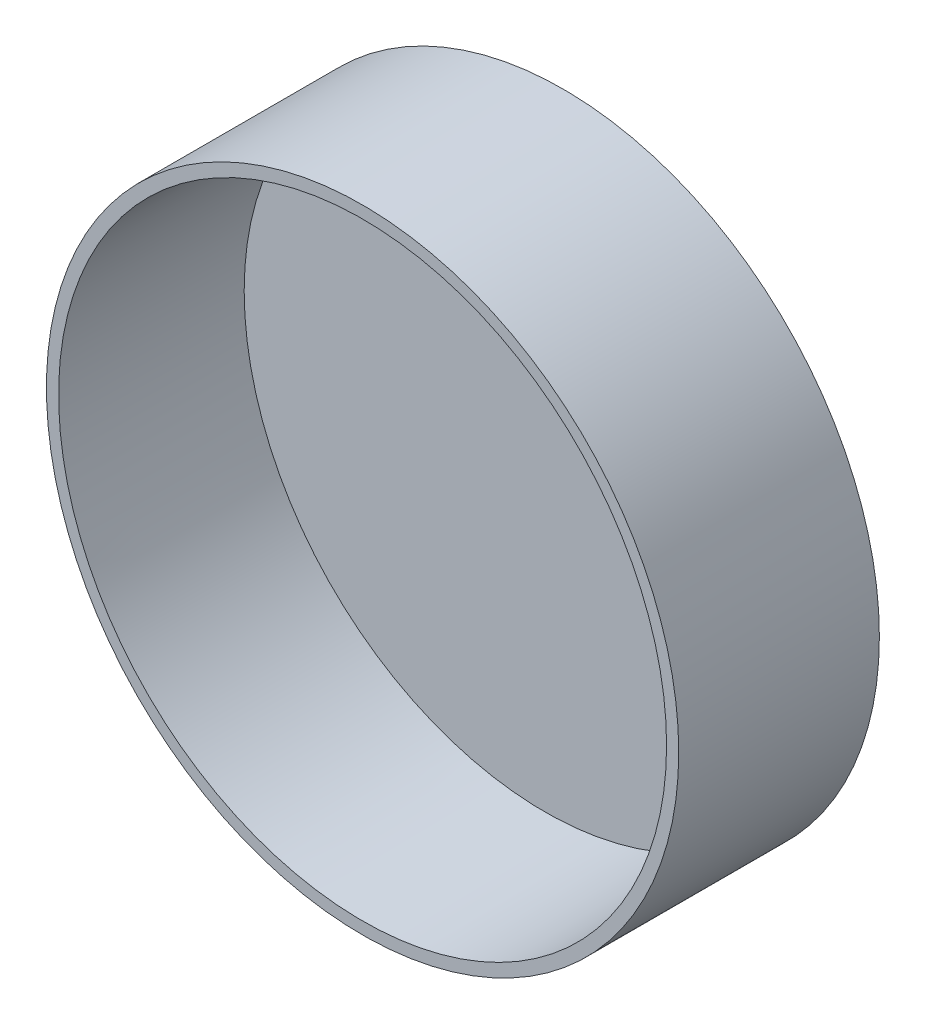
ISO-10303-21;
HEADER;
FILE_DESCRIPTION(('STEP AP214'),'2;1');
FILE_NAME('part.step','',(''),(''),'','','');
FILE_SCHEMA(('AUTOMOTIVE_DESIGN { 1 0 10303 214 1 1 1 1 }'));
ENDSEC;
DATA;
#1=APPLICATION_CONTEXT('core data for automotive mechanical design processes');
#2=APPLICATION_PROTOCOL_DEFINITION('international standard','automotive_design',2000,#1);
#3=PRODUCT_CONTEXT('',#1,'mechanical');
#4=PRODUCT('Part','Part','',(#3));
#5=PRODUCT_RELATED_PRODUCT_CATEGORY('part','',(#4));
#6=PRODUCT_DEFINITION_FORMATION('','',#4);
#7=PRODUCT_DEFINITION_CONTEXT('part definition',#1,'design');
#8=PRODUCT_DEFINITION('design','',#6,#7);
#9=PRODUCT_DEFINITION_SHAPE('','',#8);
#10=(LENGTH_UNIT() NAMED_UNIT(*) SI_UNIT(.MILLI.,.METRE.));
#11=(NAMED_UNIT(*) PLANE_ANGLE_UNIT() SI_UNIT($,.RADIAN.));
#12=(NAMED_UNIT(*) SI_UNIT($,.STERADIAN.) SOLID_ANGLE_UNIT());
#13=UNCERTAINTY_MEASURE_WITH_UNIT(LENGTH_MEASURE(1.E-05),#10,'distance_accuracy_value','');
#14=(GEOMETRIC_REPRESENTATION_CONTEXT(3) GLOBAL_UNCERTAINTY_ASSIGNED_CONTEXT((#13)) GLOBAL_UNIT_ASSIGNED_CONTEXT((#10,
#11,#12)) REPRESENTATION_CONTEXT('',''));
#15=CARTESIAN_POINT('',(0.,0.,0.));
#16=DIRECTION('',(0.,0.,1.));
#17=DIRECTION('',(1.,0.,0.));
#18=AXIS2_PLACEMENT_3D('',#15,#16,#17);
#19=CARTESIAN_POINT('',(0.,0.,6.6));
#20=DIRECTION('',(0.,0.,-1.));
#21=DIRECTION('',(-1.,0.,0.));
#22=AXIS2_PLACEMENT_3D('',#19,#20,#21);
#23=CYLINDRICAL_SURFACE('',#22,10.4);
#24=CARTESIAN_POINT('',(0.,0.,6.6));
#25=DIRECTION('',(0.,0.,1.));
#26=DIRECTION('',(1.,0.,0.));
#27=AXIS2_PLACEMENT_3D('',#24,#25,#26);
#28=CIRCLE('',#27,10.4);
#29=CARTESIAN_POINT('',(10.4,0.,6.6));
#30=VERTEX_POINT('',#29);
#31=EDGE_CURVE('E10',#30,#30,#28,.T.);
#32=ORIENTED_EDGE('',*,*,#31,.F.);
#33=EDGE_LOOP('',(#32));
#34=FACE_BOUND('',#33,.T.);
#35=CARTESIAN_POINT('',(0.,0.,0.));
#36=DIRECTION('',(0.,0.,1.));
#37=DIRECTION('',(1.,0.,0.));
#38=AXIS2_PLACEMENT_3D('',#35,#36,#37);
#39=CIRCLE('',#38,10.4);
#40=CARTESIAN_POINT('',(10.4,0.,0.));
#41=VERTEX_POINT('',#40);
#42=EDGE_CURVE('E36',#41,#41,#39,.T.);
#43=ORIENTED_EDGE('',*,*,#42,.T.);
#44=EDGE_LOOP('',(#43));
#45=FACE_BOUND('',#44,.T.);
#46=ADVANCED_FACE('F33',(#34,#45),#23,.T.);
#47=CARTESIAN_POINT('',(0.,0.,6.6));
#48=DIRECTION('',(0.,0.,1.));
#49=DIRECTION('',(1.,0.,0.));
#50=AXIS2_PLACEMENT_3D('',#47,#48,#49);
#51=PLANE('',#50);
#52=CARTESIAN_POINT('',(0.,0.,6.6));
#53=DIRECTION('',(0.,0.,1.));
#54=DIRECTION('',(1.,0.,0.));
#55=AXIS2_PLACEMENT_3D('',#52,#53,#54);
#56=CIRCLE('',#55,10.);
#57=CARTESIAN_POINT('',(10.,0.,6.6));
#58=VERTEX_POINT('',#57);
#59=EDGE_CURVE('E47',#58,#58,#56,.T.);
#60=ORIENTED_EDGE('',*,*,#59,.F.);
#61=EDGE_LOOP('',(#60));
#62=FACE_BOUND('',#61,.T.);
#63=ORIENTED_EDGE('',*,*,#31,.T.);
#64=EDGE_LOOP('',(#63));
#65=FACE_BOUND('',#64,.T.);
#66=ADVANCED_FACE('F53',(#62,#65),#51,.T.);
#67=CARTESIAN_POINT('',(0.,0.,0.));
#68=DIRECTION('',(0.,0.,1.));
#69=DIRECTION('',(1.,0.,0.));
#70=AXIS2_PLACEMENT_3D('',#67,#68,#69);
#71=PLANE('',#70);
#72=ORIENTED_EDGE('',*,*,#42,.F.);
#73=EDGE_LOOP('',(#72));
#74=FACE_BOUND('',#73,.T.);
#75=ADVANCED_FACE('F55',(#74),#71,.F.);
#76=CARTESIAN_POINT('',(0.,0.,6.6));
#77=DIRECTION('',(0.,0.,1.));
#78=DIRECTION('',(1.,0.,0.));
#79=AXIS2_PLACEMENT_3D('',#76,#77,#78);
#80=CONICAL_SURFACE('',#79,10.,0.0174532925199433);
#81=CARTESIAN_POINT('',(0.,0.,0.6));
#82=DIRECTION('',(0.,0.,1.));
#83=DIRECTION('',(1.,0.,0.));
#84=AXIS2_PLACEMENT_3D('',#81,#82,#83);
#85=CIRCLE('',#84,9.89526961043069);
#86=CARTESIAN_POINT('',(9.89526961043069,0.,0.6));
#87=VERTEX_POINT('',#86);
#88=EDGE_CURVE('E43',#87,#87,#85,.T.);
#89=ORIENTED_EDGE('',*,*,#88,.F.);
#90=EDGE_LOOP('',(#89));
#91=FACE_BOUND('',#90,.T.);
#92=ORIENTED_EDGE('',*,*,#59,.T.);
#93=EDGE_LOOP('',(#92));
#94=FACE_BOUND('',#93,.T.);
#95=ADVANCED_FACE('F51',(#91,#94),#80,.F.);
#96=CARTESIAN_POINT('',(0.,0.,0.6));
#97=DIRECTION('',(0.,0.,1.));
#98=DIRECTION('',(1.,0.,0.));
#99=AXIS2_PLACEMENT_3D('',#96,#97,#98);
#100=PLANE('',#99);
#101=ORIENTED_EDGE('',*,*,#88,.T.);
#102=EDGE_LOOP('',(#101));
#103=FACE_BOUND('',#102,.T.);
#104=ADVANCED_FACE('F66',(#103),#100,.T.);
#105=CLOSED_SHELL('',(#46,#66,#75,#95,#104));
#106=MANIFOLD_SOLID_BREP('B2',#105);
#107=ADVANCED_BREP_SHAPE_REPRESENTATION('',(#18,#106),#14);
#108=SHAPE_DEFINITION_REPRESENTATION(#9,#107);
ENDSEC;
END-ISO-10303-21;
